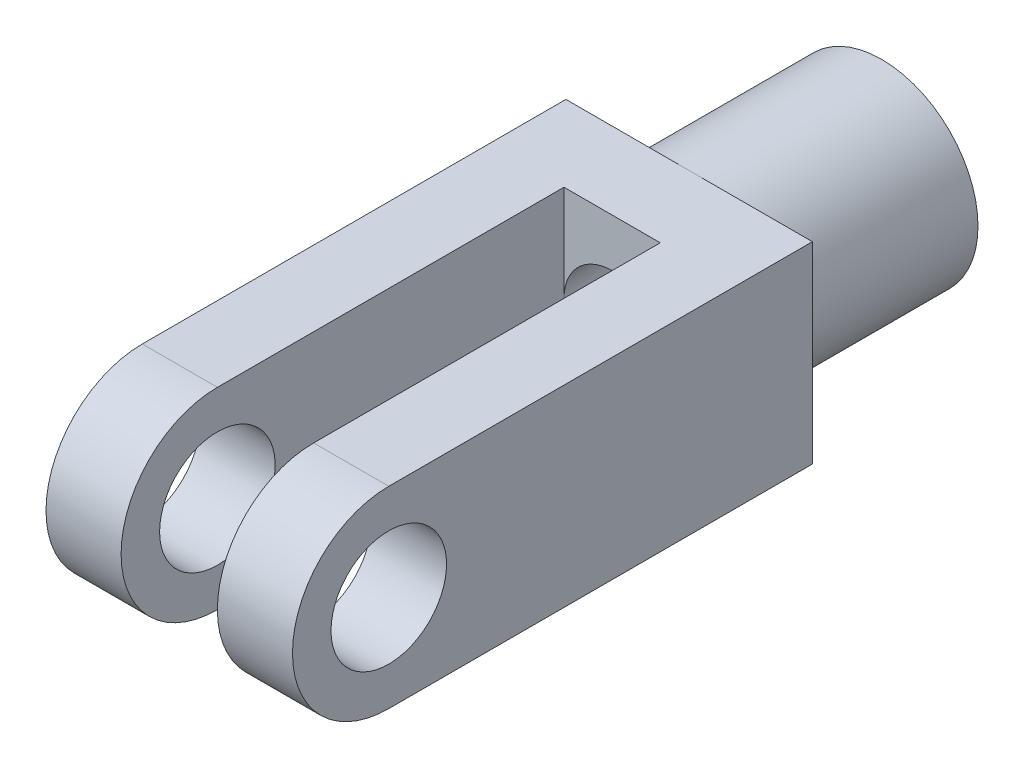
ISO-10303-21;
HEADER;
FILE_DESCRIPTION(('STEP AP214'),'2;1');
FILE_NAME('part.step','',(''),(''),'','','');
FILE_SCHEMA(('AUTOMOTIVE_DESIGN { 1 0 10303 214 1 1 1 1 }'));
ENDSEC;
DATA;
#1=APPLICATION_CONTEXT('core data for automotive mechanical design processes');
#2=APPLICATION_PROTOCOL_DEFINITION('international standard','automotive_design',2000,#1);
#3=PRODUCT_CONTEXT('',#1,'mechanical');
#4=PRODUCT('Part','Part','',(#3));
#5=PRODUCT_RELATED_PRODUCT_CATEGORY('part','',(#4));
#6=PRODUCT_DEFINITION_FORMATION('','',#4);
#7=PRODUCT_DEFINITION_CONTEXT('part definition',#1,'design');
#8=PRODUCT_DEFINITION('design','',#6,#7);
#9=PRODUCT_DEFINITION_SHAPE('','',#8);
#10=(LENGTH_UNIT() NAMED_UNIT(*) SI_UNIT(.MILLI.,.METRE.));
#11=(NAMED_UNIT(*) PLANE_ANGLE_UNIT() SI_UNIT($,.RADIAN.));
#12=(NAMED_UNIT(*) SI_UNIT($,.STERADIAN.) SOLID_ANGLE_UNIT());
#13=UNCERTAINTY_MEASURE_WITH_UNIT(LENGTH_MEASURE(1.E-05),#10,'distance_accuracy_value','');
#14=(GEOMETRIC_REPRESENTATION_CONTEXT(3) GLOBAL_UNCERTAINTY_ASSIGNED_CONTEXT((#13)) GLOBAL_UNIT_ASSIGNED_CONTEXT((#10,
#11,#12)) REPRESENTATION_CONTEXT('',''));
#15=CARTESIAN_POINT('',(0.,0.,0.));
#16=DIRECTION('',(0.,0.,1.));
#17=DIRECTION('',(1.,0.,0.));
#18=AXIS2_PLACEMENT_3D('',#15,#16,#17);
#19=CARTESIAN_POINT('',(0.,0.,7.));
#20=DIRECTION('',(0.,0.,1.));
#21=DIRECTION('',(1.,0.,0.));
#22=AXIS2_PLACEMENT_3D('',#19,#20,#21);
#23=PLANE('',#22);
#24=CARTESIAN_POINT('',(0.,0.,7.));
#25=DIRECTION('',(0.,0.,1.));
#26=DIRECTION('',(1.,0.,0.));
#27=AXIS2_PLACEMENT_3D('',#24,#25,#26);
#28=CIRCLE('',#27,1.25);
#29=CARTESIAN_POINT('',(1.25,0.,7.));
#30=VERTEX_POINT('',#29);
#31=CARTESIAN_POINT('',(-1.25,0.,7.));
#32=VERTEX_POINT('',#31);
#33=EDGE_CURVE('E51',#30,#32,#28,.T.);
#34=ORIENTED_EDGE('',*,*,#33,.F.);
#35=DIRECTION('',(0.,1.,0.));
#36=VECTOR('',#35,1.);
#37=CARTESIAN_POINT('',(1.25,2.5,7.));
#38=LINE('',#37,#36);
#39=CARTESIAN_POINT('',(1.25,2.5,7.));
#40=VERTEX_POINT('',#39);
#41=EDGE_CURVE('E123',#30,#40,#38,.T.);
#42=ORIENTED_EDGE('',*,*,#41,.T.);
#43=DIRECTION('',(-1.,0.,0.));
#44=VECTOR('',#43,1.);
#45=CARTESIAN_POINT('',(-1.25,2.5,7.));
#46=LINE('',#45,#44);
#47=CARTESIAN_POINT('',(-1.25,2.5,7.));
#48=VERTEX_POINT('',#47);
#49=EDGE_CURVE('E141',#40,#48,#46,.T.);
#50=ORIENTED_EDGE('',*,*,#49,.T.);
#51=DIRECTION('',(0.,-1.,0.));
#52=VECTOR('',#51,1.);
#53=CARTESIAN_POINT('',(-1.25,2.5,7.));
#54=LINE('',#53,#52);
#55=EDGE_CURVE('E125',#48,#32,#54,.T.);
#56=ORIENTED_EDGE('',*,*,#55,.T.);
#57=EDGE_LOOP('',(#34,#42,#50,#56));
#58=FACE_BOUND('',#57,.T.);
#59=ADVANCED_FACE('F36',(#58),#23,.T.);
#60=CARTESIAN_POINT('',(3.2,-2.5,18.5));
#61=DIRECTION('',(0.,1.,0.));
#62=DIRECTION('',(-1.,0.,0.));
#63=AXIS2_PLACEMENT_3D('',#60,#61,#62);
#64=PLANE('',#63);
#65=DIRECTION('',(-1.,0.,0.));
#66=VECTOR('',#65,1.);
#67=CARTESIAN_POINT('',(3.8,-2.5,16.));
#68=LINE('',#67,#66);
#69=CARTESIAN_POINT('',(-1.25,-2.5,16.));
#70=VERTEX_POINT('',#69);
#71=CARTESIAN_POINT('',(-3.2,-2.5,16.));
#72=VERTEX_POINT('',#71);
#73=EDGE_CURVE('E59',#70,#72,#68,.T.);
#74=ORIENTED_EDGE('',*,*,#73,.T.);
#75=DIRECTION('',(0.,0.,-1.));
#76=VECTOR('',#75,1.);
#77=CARTESIAN_POINT('',(-3.2,-2.5,18.5));
#78=LINE('',#77,#76);
#79=CARTESIAN_POINT('',(-3.2,-2.5,5.));
#80=VERTEX_POINT('',#79);
#81=EDGE_CURVE('E175',#72,#80,#78,.T.);
#82=ORIENTED_EDGE('',*,*,#81,.T.);
#83=DIRECTION('',(1.,0.,0.));
#84=VECTOR('',#83,1.);
#85=CARTESIAN_POINT('',(3.2,-2.5,5.));
#86=LINE('',#85,#84);
#87=CARTESIAN_POINT('',(0.,-2.5,5.));
#88=VERTEX_POINT('',#87);
#89=EDGE_CURVE('E159',#80,#88,#86,.T.);
#90=ORIENTED_EDGE('',*,*,#89,.T.);
#91=CARTESIAN_POINT('',(3.2,-2.5,5.));
#92=VERTEX_POINT('',#91);
#93=EDGE_CURVE('E158',#88,#92,#86,.T.);
#94=ORIENTED_EDGE('',*,*,#93,.T.);
#95=DIRECTION('',(0.,0.,-1.));
#96=VECTOR('',#95,1.);
#97=CARTESIAN_POINT('',(3.2,-2.5,18.5));
#98=LINE('',#97,#96);
#99=CARTESIAN_POINT('',(3.2,-2.5,16.));
#100=VERTEX_POINT('',#99);
#101=EDGE_CURVE('E173',#100,#92,#98,.T.);
#102=ORIENTED_EDGE('',*,*,#101,.F.);
#103=CARTESIAN_POINT('',(1.25,-2.5,16.));
#104=VERTEX_POINT('',#103);
#105=EDGE_CURVE('E226',#100,#104,#68,.T.);
#106=ORIENTED_EDGE('',*,*,#105,.T.);
#107=DIRECTION('',(0.,0.,1.));
#108=VECTOR('',#107,1.);
#109=CARTESIAN_POINT('',(1.25,-2.5,7.));
#110=LINE('',#109,#108);
#111=CARTESIAN_POINT('',(1.25,-2.5,7.));
#112=VERTEX_POINT('',#111);
#113=EDGE_CURVE('E152',#112,#104,#110,.T.);
#114=ORIENTED_EDGE('',*,*,#113,.F.);
#115=DIRECTION('',(1.,0.,0.));
#116=VECTOR('',#115,1.);
#117=CARTESIAN_POINT('',(-1.25,-2.5,7.));
#118=LINE('',#117,#116);
#119=CARTESIAN_POINT('',(-1.25,-2.5,7.));
#120=VERTEX_POINT('',#119);
#121=EDGE_CURVE('E136',#120,#112,#118,.T.);
#122=ORIENTED_EDGE('',*,*,#121,.F.);
#123=DIRECTION('',(0.,0.,1.));
#124=VECTOR('',#123,1.);
#125=CARTESIAN_POINT('',(-1.25,-2.5,7.));
#126=LINE('',#125,#124);
#127=EDGE_CURVE('E142',#120,#70,#126,.T.);
#128=ORIENTED_EDGE('',*,*,#127,.T.);
#129=EDGE_LOOP('',(#74,#82,#90,#94,#102,#106,#114,#122,#128));
#130=FACE_BOUND('',#129,.T.);
#131=ADVANCED_FACE('F217',(#130),#64,.F.);
#132=CARTESIAN_POINT('',(0.,0.,0.));
#133=DIRECTION('',(0.,0.,1.));
#134=DIRECTION('',(1.,0.,0.));
#135=AXIS2_PLACEMENT_3D('',#132,#133,#134);
#136=PLANE('',#135);
#137=CARTESIAN_POINT('',(0.,0.,0.));
#138=DIRECTION('',(0.,0.,1.));
#139=DIRECTION('',(1.,0.,0.));
#140=AXIS2_PLACEMENT_3D('',#137,#138,#139);
#141=CIRCLE('',#140,2.5);
#142=CARTESIAN_POINT('',(2.5,0.,0.));
#143=VERTEX_POINT('',#142);
#144=EDGE_CURVE('E183',#143,#143,#141,.T.);
#145=ORIENTED_EDGE('',*,*,#144,.F.);
#146=EDGE_LOOP('',(#145));
#147=FACE_BOUND('',#146,.T.);
#148=CARTESIAN_POINT('',(0.,0.,0.));
#149=DIRECTION('',(0.,0.,1.));
#150=DIRECTION('',(1.,0.,0.));
#151=AXIS2_PLACEMENT_3D('',#148,#149,#150);
#152=CIRCLE('',#151,1.5);
#153=CARTESIAN_POINT('',(1.5,0.,0.));
#154=VERTEX_POINT('',#153);
#155=EDGE_CURVE('E180',#154,#154,#152,.T.);
#156=ORIENTED_EDGE('',*,*,#155,.T.);
#157=EDGE_LOOP('',(#156));
#158=FACE_BOUND('',#157,.T.);
#159=ADVANCED_FACE('F262',(#147,#158),#136,.F.);
#160=CARTESIAN_POINT('',(0.,0.,5.));
#161=DIRECTION('',(0.,0.,-1.));
#162=DIRECTION('',(-1.,0.,0.));
#163=AXIS2_PLACEMENT_3D('',#160,#161,#162);
#164=CYLINDRICAL_SURFACE('',#163,2.5);
#165=CARTESIAN_POINT('',(0.,0.,5.));
#166=DIRECTION('',(0.,0.,1.));
#167=DIRECTION('',(1.,0.,0.));
#168=AXIS2_PLACEMENT_3D('',#165,#166,#167);
#169=CIRCLE('',#168,2.5);
#170=CARTESIAN_POINT('',(0.,2.5,5.));
#171=VERTEX_POINT('',#170);
#172=EDGE_CURVE('E45',#171,#88,#169,.T.);
#173=ORIENTED_EDGE('',*,*,#172,.F.);
#174=EDGE_CURVE('E186',#88,#171,#169,.T.);
#175=ORIENTED_EDGE('',*,*,#174,.F.);
#176=EDGE_LOOP('',(#173,#175));
#177=FACE_BOUND('',#176,.T.);
#178=ORIENTED_EDGE('',*,*,#144,.T.);
#179=EDGE_LOOP('',(#178));
#180=FACE_BOUND('',#179,.T.);
#181=ADVANCED_FACE('F38',(#177,#180),#164,.T.);
#182=CARTESIAN_POINT('',(0.,0.,5.));
#183=DIRECTION('',(0.,0.,-1.));
#184=DIRECTION('',(-1.,0.,0.));
#185=AXIS2_PLACEMENT_3D('',#182,#183,#184);
#186=CYLINDRICAL_SURFACE('',#185,1.5);
#187=CARTESIAN_POINT('',(0.,0.,5.));
#188=DIRECTION('',(0.,0.,1.));
#189=DIRECTION('',(1.,0.,0.));
#190=AXIS2_PLACEMENT_3D('',#187,#188,#189);
#191=CIRCLE('',#190,1.5);
#192=CARTESIAN_POINT('',(1.5,0.,5.));
#193=VERTEX_POINT('',#192);
#194=EDGE_CURVE('E177',#193,#193,#191,.T.);
#195=ORIENTED_EDGE('',*,*,#194,.T.);
#196=EDGE_LOOP('',(#195));
#197=FACE_BOUND('',#196,.T.);
#198=ORIENTED_EDGE('',*,*,#155,.F.);
#199=EDGE_LOOP('',(#198));
#200=FACE_BOUND('',#199,.T.);
#201=ADVANCED_FACE('F253',(#197,#200),#186,.F.);
#202=CARTESIAN_POINT('',(0.,0.,5.));
#203=DIRECTION('',(0.,0.,-1.));
#204=DIRECTION('',(-1.,0.,0.));
#205=AXIS2_PLACEMENT_3D('',#202,#203,#204);
#206=PLANE('',#205);
#207=CARTESIAN_POINT('',(0.,0.,5.));
#208=DIRECTION('',(0.,0.,-1.));
#209=DIRECTION('',(-1.,0.,0.));
#210=AXIS2_PLACEMENT_3D('',#207,#208,#209);
#211=CIRCLE('',#210,1.25);
#212=CARTESIAN_POINT('',(-1.25,0.,5.));
#213=VERTEX_POINT('',#212);
#214=EDGE_CURVE('E117',#213,#213,#211,.T.);
#215=ORIENTED_EDGE('',*,*,#214,.F.);
#216=EDGE_LOOP('',(#215));
#217=FACE_BOUND('',#216,.T.);
#218=ORIENTED_EDGE('',*,*,#194,.F.);
#219=EDGE_LOOP('',(#218));
#220=FACE_BOUND('',#219,.T.);
#221=ADVANCED_FACE('F250',(#217,#220),#206,.T.);
#222=DIRECTION('',(-1.,0.,0.));
#223=VECTOR('',#222,1.);
#224=CARTESIAN_POINT('',(3.2,2.5,5.));
#225=LINE('',#224,#223);
#226=CARTESIAN_POINT('',(-3.2,2.5,5.));
#227=VERTEX_POINT('',#226);
#228=EDGE_CURVE('E165',#171,#227,#225,.T.);
#229=ORIENTED_EDGE('',*,*,#228,.F.);
#230=ORIENTED_EDGE('',*,*,#172,.T.);
#231=ORIENTED_EDGE('',*,*,#89,.F.);
#232=DIRECTION('',(0.,-1.,0.));
#233=VECTOR('',#232,1.);
#234=CARTESIAN_POINT('',(-3.2,2.5,5.));
#235=LINE('',#234,#233);
#236=EDGE_CURVE('E150',#227,#80,#235,.T.);
#237=ORIENTED_EDGE('',*,*,#236,.F.);
#238=EDGE_LOOP('',(#229,#230,#231,#237));
#239=FACE_BOUND('',#238,.T.);
#240=ADVANCED_FACE('F202',(#239),#206,.T.);
#241=CARTESIAN_POINT('',(-3.2,2.5,18.5));
#242=DIRECTION('',(1.,0.,0.));
#243=DIRECTION('',(0.,1.,0.));
#244=AXIS2_PLACEMENT_3D('',#241,#242,#243);
#245=PLANE('',#244);
#246=CARTESIAN_POINT('',(-3.2,0.,16.));
#247=DIRECTION('',(-1.,0.,0.));
#248=DIRECTION('',(0.,0.,1.));
#249=AXIS2_PLACEMENT_3D('',#246,#247,#248);
#250=CIRCLE('',#249,1.49999999999999);
#251=CARTESIAN_POINT('',(-3.2,0.,17.5));
#252=VERTEX_POINT('',#251);
#253=EDGE_CURVE('E126',#252,#252,#250,.T.);
#254=ORIENTED_EDGE('',*,*,#253,.F.);
#255=EDGE_LOOP('',(#254));
#256=FACE_BOUND('',#255,.T.);
#257=ORIENTED_EDGE('',*,*,#81,.F.);
#258=CARTESIAN_POINT('',(-3.2,0.,16.));
#259=DIRECTION('',(1.,0.,0.));
#260=DIRECTION('',(0.,0.,1.));
#261=AXIS2_PLACEMENT_3D('',#258,#259,#260);
#262=CIRCLE('',#261,2.5);
#263=CARTESIAN_POINT('',(-3.2,2.5,16.));
#264=VERTEX_POINT('',#263);
#265=EDGE_CURVE('E221',#264,#72,#262,.T.);
#266=ORIENTED_EDGE('',*,*,#265,.F.);
#267=DIRECTION('',(0.,0.,-1.));
#268=VECTOR('',#267,1.);
#269=CARTESIAN_POINT('',(-3.2,2.5,18.5));
#270=LINE('',#269,#268);
#271=EDGE_CURVE('E169',#264,#227,#270,.T.);
#272=ORIENTED_EDGE('',*,*,#271,.T.);
#273=ORIENTED_EDGE('',*,*,#236,.T.);
#274=EDGE_LOOP('',(#257,#266,#272,#273));
#275=FACE_BOUND('',#274,.T.);
#276=ADVANCED_FACE('F220',(#256,#275),#245,.F.);
#277=CARTESIAN_POINT('',(3.2,2.5,18.5));
#278=DIRECTION('',(-1.,0.,0.));
#279=DIRECTION('',(0.,0.,1.));
#280=AXIS2_PLACEMENT_3D('',#277,#278,#279);
#281=PLANE('',#280);
#282=CARTESIAN_POINT('',(3.2,0.,16.));
#283=DIRECTION('',(-1.,0.,0.));
#284=DIRECTION('',(0.,0.,1.));
#285=AXIS2_PLACEMENT_3D('',#282,#283,#284);
#286=CIRCLE('',#285,1.49999999999999);
#287=CARTESIAN_POINT('',(3.2,0.,17.5));
#288=VERTEX_POINT('',#287);
#289=EDGE_CURVE('E234',#288,#288,#286,.T.);
#290=ORIENTED_EDGE('',*,*,#289,.T.);
#291=EDGE_LOOP('',(#290));
#292=FACE_BOUND('',#291,.T.);
#293=DIRECTION('',(0.,0.,-1.));
#294=VECTOR('',#293,1.);
#295=CARTESIAN_POINT('',(3.2,2.5,18.5));
#296=LINE('',#295,#294);
#297=CARTESIAN_POINT('',(3.2,2.5,16.));
#298=VERTEX_POINT('',#297);
#299=CARTESIAN_POINT('',(3.2,2.5,5.));
#300=VERTEX_POINT('',#299);
#301=EDGE_CURVE('E171',#298,#300,#296,.T.);
#302=ORIENTED_EDGE('',*,*,#301,.F.);
#303=CARTESIAN_POINT('',(3.2,0.,16.));
#304=DIRECTION('',(-1.,0.,0.));
#305=DIRECTION('',(0.,0.,1.));
#306=AXIS2_PLACEMENT_3D('',#303,#304,#305);
#307=CIRCLE('',#306,2.5);
#308=EDGE_CURVE('E214',#298,#100,#307,.F.);
#309=ORIENTED_EDGE('',*,*,#308,.T.);
#310=ORIENTED_EDGE('',*,*,#101,.T.);
#311=DIRECTION('',(0.,1.,0.));
#312=VECTOR('',#311,1.);
#313=CARTESIAN_POINT('',(3.2,2.5,5.));
#314=LINE('',#313,#312);
#315=EDGE_CURVE('E162',#92,#300,#314,.T.);
#316=ORIENTED_EDGE('',*,*,#315,.T.);
#317=EDGE_LOOP('',(#302,#309,#310,#316));
#318=FACE_BOUND('',#317,.T.);
#319=ADVANCED_FACE('F212',(#292,#318),#281,.F.);
#320=CARTESIAN_POINT('',(3.2,2.5,18.5));
#321=DIRECTION('',(0.,-1.,0.));
#322=DIRECTION('',(1.,0.,0.));
#323=AXIS2_PLACEMENT_3D('',#320,#321,#322);
#324=PLANE('',#323);
#325=ORIENTED_EDGE('',*,*,#271,.F.);
#326=DIRECTION('',(-1.,0.,0.));
#327=VECTOR('',#326,1.);
#328=CARTESIAN_POINT('',(3.8,2.5,16.));
#329=LINE('',#328,#327);
#330=CARTESIAN_POINT('',(-1.25,2.5,16.));
#331=VERTEX_POINT('',#330);
#332=EDGE_CURVE('E225',#331,#264,#329,.T.);
#333=ORIENTED_EDGE('',*,*,#332,.F.);
#334=DIRECTION('',(0.,0.,1.));
#335=VECTOR('',#334,1.);
#336=CARTESIAN_POINT('',(-1.25,2.5,7.));
#337=LINE('',#336,#335);
#338=EDGE_CURVE('E147',#48,#331,#337,.T.);
#339=ORIENTED_EDGE('',*,*,#338,.F.);
#340=ORIENTED_EDGE('',*,*,#49,.F.);
#341=DIRECTION('',(0.,0.,1.));
#342=VECTOR('',#341,1.);
#343=CARTESIAN_POINT('',(1.25,2.5,7.));
#344=LINE('',#343,#342);
#345=CARTESIAN_POINT('',(1.25,2.5,16.));
#346=VERTEX_POINT('',#345);
#347=EDGE_CURVE('E134',#40,#346,#344,.T.);
#348=ORIENTED_EDGE('',*,*,#347,.T.);
#349=EDGE_CURVE('E209',#298,#346,#329,.T.);
#350=ORIENTED_EDGE('',*,*,#349,.F.);
#351=ORIENTED_EDGE('',*,*,#301,.T.);
#352=EDGE_CURVE('E166',#300,#171,#225,.T.);
#353=ORIENTED_EDGE('',*,*,#352,.T.);
#354=ORIENTED_EDGE('',*,*,#228,.T.);
#355=EDGE_LOOP('',(#325,#333,#339,#340,#348,#350,#351,#353,#354));
#356=FACE_BOUND('',#355,.T.);
#357=ADVANCED_FACE('F206',(#356),#324,.F.);
#358=ORIENTED_EDGE('',*,*,#93,.F.);
#359=ORIENTED_EDGE('',*,*,#174,.T.);
#360=ORIENTED_EDGE('',*,*,#352,.F.);
#361=ORIENTED_EDGE('',*,*,#315,.F.);
#362=EDGE_LOOP('',(#358,#359,#360,#361));
#363=FACE_BOUND('',#362,.T.);
#364=ADVANCED_FACE('F195',(#363),#206,.T.);
#365=CARTESIAN_POINT('',(-1.25,2.5,7.));
#366=DIRECTION('',(-1.,0.,0.));
#367=DIRECTION('',(0.,-1.,0.));
#368=AXIS2_PLACEMENT_3D('',#365,#366,#367);
#369=PLANE('',#368);
#370=EDGE_CURVE('E233',#32,#120,#54,.T.);
#371=ORIENTED_EDGE('',*,*,#370,.F.);
#372=ORIENTED_EDGE('',*,*,#55,.F.);
#373=ORIENTED_EDGE('',*,*,#338,.T.);
#374=CARTESIAN_POINT('',(-1.25,0.,16.));
#375=DIRECTION('',(-1.,0.,0.));
#376=DIRECTION('',(0.,-1.,0.));
#377=AXIS2_PLACEMENT_3D('',#374,#375,#376);
#378=CIRCLE('',#377,2.5);
#379=EDGE_CURVE('E232',#331,#70,#378,.F.);
#380=ORIENTED_EDGE('',*,*,#379,.T.);
#381=ORIENTED_EDGE('',*,*,#127,.F.);
#382=EDGE_LOOP('',(#371,#372,#373,#380,#381));
#383=FACE_BOUND('',#382,.T.);
#384=CARTESIAN_POINT('',(-1.25,0.,16.));
#385=DIRECTION('',(-1.,0.,0.));
#386=DIRECTION('',(0.,-1.,0.));
#387=AXIS2_PLACEMENT_3D('',#384,#385,#386);
#388=CIRCLE('',#387,1.49999999999999);
#389=CARTESIAN_POINT('',(-1.25,-1.49999999999999,16.));
#390=VERTEX_POINT('',#389);
#391=EDGE_CURVE('E238',#390,#390,#388,.T.);
#392=ORIENTED_EDGE('',*,*,#391,.T.);
#393=EDGE_LOOP('',(#392));
#394=FACE_BOUND('',#393,.T.);
#395=ADVANCED_FACE('F229',(#383,#394),#369,.F.);
#396=CARTESIAN_POINT('',(1.25,2.5,7.));
#397=DIRECTION('',(1.,0.,0.));
#398=DIRECTION('',(0.,1.,0.));
#399=AXIS2_PLACEMENT_3D('',#396,#397,#398);
#400=PLANE('',#399);
#401=ORIENTED_EDGE('',*,*,#41,.F.);
#402=EDGE_CURVE('E131',#112,#30,#38,.T.);
#403=ORIENTED_EDGE('',*,*,#402,.F.);
#404=ORIENTED_EDGE('',*,*,#113,.T.);
#405=CARTESIAN_POINT('',(1.25,0.,16.));
#406=DIRECTION('',(1.,0.,0.));
#407=DIRECTION('',(0.,1.,0.));
#408=AXIS2_PLACEMENT_3D('',#405,#406,#407);
#409=CIRCLE('',#408,2.5);
#410=EDGE_CURVE('E11',#104,#346,#409,.F.);
#411=ORIENTED_EDGE('',*,*,#410,.T.);
#412=ORIENTED_EDGE('',*,*,#347,.F.);
#413=EDGE_LOOP('',(#401,#403,#404,#411,#412));
#414=FACE_BOUND('',#413,.T.);
#415=CARTESIAN_POINT('',(1.25,0.,16.));
#416=DIRECTION('',(1.,0.,0.));
#417=DIRECTION('',(0.,1.,0.));
#418=AXIS2_PLACEMENT_3D('',#415,#416,#417);
#419=CIRCLE('',#418,1.49999999999999);
#420=CARTESIAN_POINT('',(1.25,1.49999999999999,16.));
#421=VERTEX_POINT('',#420);
#422=EDGE_CURVE('E40',#421,#421,#419,.T.);
#423=ORIENTED_EDGE('',*,*,#422,.T.);
#424=EDGE_LOOP('',(#423));
#425=FACE_BOUND('',#424,.T.);
#426=ADVANCED_FACE('F128',(#414,#425),#400,.F.);
#427=EDGE_CURVE('E111',#32,#30,#28,.T.);
#428=ORIENTED_EDGE('',*,*,#427,.F.);
#429=ORIENTED_EDGE('',*,*,#370,.T.);
#430=ORIENTED_EDGE('',*,*,#121,.T.);
#431=ORIENTED_EDGE('',*,*,#402,.T.);
#432=EDGE_LOOP('',(#428,#429,#430,#431));
#433=FACE_BOUND('',#432,.T.);
#434=ADVANCED_FACE('F138',(#433),#23,.T.);
#435=CARTESIAN_POINT('',(3.8,0.,16.));
#436=DIRECTION('',(-1.,0.,0.));
#437=DIRECTION('',(0.,0.,1.));
#438=AXIS2_PLACEMENT_3D('',#435,#436,#437);
#439=CYLINDRICAL_SURFACE('',#438,2.5);
#440=ORIENTED_EDGE('',*,*,#308,.F.);
#441=ORIENTED_EDGE('',*,*,#349,.T.);
#442=ORIENTED_EDGE('',*,*,#410,.F.);
#443=ORIENTED_EDGE('',*,*,#105,.F.);
#444=EDGE_LOOP('',(#440,#441,#442,#443));
#445=FACE_BOUND('',#444,.T.);
#446=ADVANCED_FACE('F277',(#445),#439,.T.);
#447=CARTESIAN_POINT('',(3.8,0.,16.));
#448=DIRECTION('',(-1.,0.,0.));
#449=DIRECTION('',(0.,0.,1.));
#450=AXIS2_PLACEMENT_3D('',#447,#448,#449);
#451=CYLINDRICAL_SURFACE('',#450,1.49999999999999);
#452=ORIENTED_EDGE('',*,*,#422,.F.);
#453=EDGE_LOOP('',(#452));
#454=FACE_BOUND('',#453,.T.);
#455=ORIENTED_EDGE('',*,*,#289,.F.);
#456=EDGE_LOOP('',(#455));
#457=FACE_BOUND('',#456,.T.);
#458=ADVANCED_FACE('F282',(#454,#457),#451,.F.);
#459=ORIENTED_EDGE('',*,*,#265,.T.);
#460=ORIENTED_EDGE('',*,*,#73,.F.);
#461=ORIENTED_EDGE('',*,*,#379,.F.);
#462=ORIENTED_EDGE('',*,*,#332,.T.);
#463=EDGE_LOOP('',(#459,#460,#461,#462));
#464=FACE_BOUND('',#463,.T.);
#465=ADVANCED_FACE('F284',(#464),#439,.T.);
#466=ORIENTED_EDGE('',*,*,#253,.T.);
#467=EDGE_LOOP('',(#466));
#468=FACE_BOUND('',#467,.T.);
#469=ORIENTED_EDGE('',*,*,#391,.F.);
#470=EDGE_LOOP('',(#469));
#471=FACE_BOUND('',#470,.T.);
#472=ADVANCED_FACE('F303',(#468,#471),#451,.F.);
#473=CARTESIAN_POINT('',(0.,0.,15.));
#474=DIRECTION('',(0.,0.,-1.));
#475=DIRECTION('',(-1.,0.,0.));
#476=AXIS2_PLACEMENT_3D('',#473,#474,#475);
#477=CYLINDRICAL_SURFACE('',#476,1.25);
#478=ORIENTED_EDGE('',*,*,#33,.T.);
#479=ORIENTED_EDGE('',*,*,#427,.T.);
#480=EDGE_LOOP('',(#478,#479));
#481=FACE_BOUND('',#480,.T.);
#482=ORIENTED_EDGE('',*,*,#214,.T.);
#483=EDGE_LOOP('',(#482));
#484=FACE_BOUND('',#483,.T.);
#485=ADVANCED_FACE('F112',(#481,#484),#477,.F.);
#486=CLOSED_SHELL('',(#59,#131,#159,#181,#201,#221,#240,#276,#319,#357,#364,#395,#426,#434,#446,
#458,#465,#472,#485));
#487=MANIFOLD_SOLID_BREP('B2',#486);
#488=ADVANCED_BREP_SHAPE_REPRESENTATION('',(#18,#487),#14);
#489=SHAPE_DEFINITION_REPRESENTATION(#9,#488);
ENDSEC;
END-ISO-10303-21;
